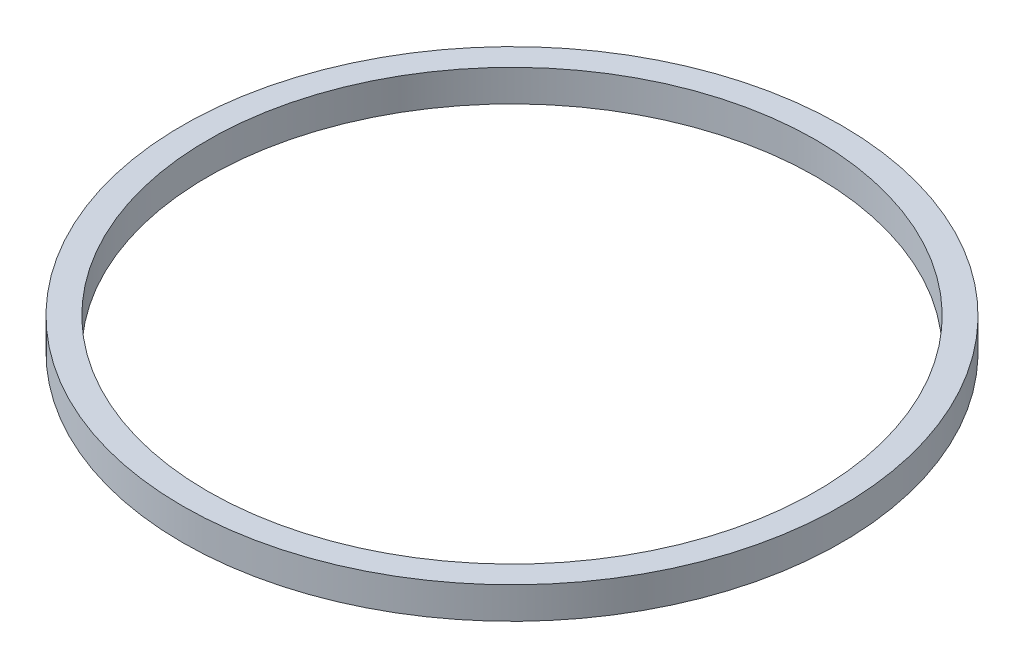
ISO-10303-21;
HEADER;
FILE_DESCRIPTION(('STEP AP214'),'2;1');
FILE_NAME('part.step','',(''),(''),'','','');
FILE_SCHEMA(('AUTOMOTIVE_DESIGN { 1 0 10303 214 1 1 1 1 }'));
ENDSEC;
DATA;
#1=APPLICATION_CONTEXT('core data for automotive mechanical design processes');
#2=APPLICATION_PROTOCOL_DEFINITION('international standard','automotive_design',2000,#1);
#3=PRODUCT_CONTEXT('',#1,'mechanical');
#4=PRODUCT('Part','Part','',(#3));
#5=PRODUCT_RELATED_PRODUCT_CATEGORY('part','',(#4));
#6=PRODUCT_DEFINITION_FORMATION('','',#4);
#7=PRODUCT_DEFINITION_CONTEXT('part definition',#1,'design');
#8=PRODUCT_DEFINITION('design','',#6,#7);
#9=PRODUCT_DEFINITION_SHAPE('','',#8);
#10=(LENGTH_UNIT() NAMED_UNIT(*) SI_UNIT(.MILLI.,.METRE.));
#11=(NAMED_UNIT(*) PLANE_ANGLE_UNIT() SI_UNIT($,.RADIAN.));
#12=(NAMED_UNIT(*) SI_UNIT($,.STERADIAN.) SOLID_ANGLE_UNIT());
#13=UNCERTAINTY_MEASURE_WITH_UNIT(LENGTH_MEASURE(1.E-05),#10,'distance_accuracy_value','');
#14=(GEOMETRIC_REPRESENTATION_CONTEXT(3) GLOBAL_UNCERTAINTY_ASSIGNED_CONTEXT((#13)) GLOBAL_UNIT_ASSIGNED_CONTEXT((#10,
#11,#12)) REPRESENTATION_CONTEXT('',''));
#15=CARTESIAN_POINT('',(0.,0.,0.));
#16=DIRECTION('',(0.,0.,1.));
#17=DIRECTION('',(1.,0.,0.));
#18=AXIS2_PLACEMENT_3D('',#15,#16,#17);
#19=CARTESIAN_POINT('',(0.,2.5,0.));
#20=DIRECTION('',(0.,1.,0.));
#21=DIRECTION('',(0.,0.,1.));
#22=AXIS2_PLACEMENT_3D('',#19,#20,#21);
#23=PLANE('',#22);
#24=CARTESIAN_POINT('',(0.,2.5,0.));
#25=DIRECTION('',(0.,1.,0.));
#26=DIRECTION('',(0.,0.,1.));
#27=AXIS2_PLACEMENT_3D('',#24,#25,#26);
#28=CIRCLE('',#27,26.);
#29=CARTESIAN_POINT('',(0.,2.5,26.));
#30=VERTEX_POINT('',#29);
#31=EDGE_CURVE('E10',#30,#30,#28,.T.);
#32=ORIENTED_EDGE('',*,*,#31,.T.);
#33=EDGE_LOOP('',(#32));
#34=FACE_BOUND('',#33,.T.);
#35=CARTESIAN_POINT('',(0.,2.5,0.));
#36=DIRECTION('',(0.,1.,0.));
#37=DIRECTION('',(0.,0.,1.));
#38=AXIS2_PLACEMENT_3D('',#35,#36,#37);
#39=CIRCLE('',#38,24.);
#40=CARTESIAN_POINT('',(0.,2.5,24.));
#41=VERTEX_POINT('',#40);
#42=EDGE_CURVE('E56',#41,#41,#39,.T.);
#43=ORIENTED_EDGE('',*,*,#42,.F.);
#44=EDGE_LOOP('',(#43));
#45=FACE_BOUND('',#44,.T.);
#46=ADVANCED_FACE('F43',(#34,#45),#23,.T.);
#47=CARTESIAN_POINT('',(0.,0.,0.));
#48=DIRECTION('',(0.,1.,0.));
#49=DIRECTION('',(0.,0.,1.));
#50=AXIS2_PLACEMENT_3D('',#47,#48,#49);
#51=PLANE('',#50);
#52=CARTESIAN_POINT('',(0.,0.,0.));
#53=DIRECTION('',(0.,1.,0.));
#54=DIRECTION('',(0.,0.,1.));
#55=AXIS2_PLACEMENT_3D('',#52,#53,#54);
#56=CIRCLE('',#55,26.);
#57=CARTESIAN_POINT('',(0.,0.,26.));
#58=VERTEX_POINT('',#57);
#59=EDGE_CURVE('E47',#58,#58,#56,.T.);
#60=ORIENTED_EDGE('',*,*,#59,.F.);
#61=EDGE_LOOP('',(#60));
#62=FACE_BOUND('',#61,.T.);
#63=CARTESIAN_POINT('',(0.,0.,0.));
#64=DIRECTION('',(0.,1.,0.));
#65=DIRECTION('',(0.,0.,1.));
#66=AXIS2_PLACEMENT_3D('',#63,#64,#65);
#67=CIRCLE('',#66,24.);
#68=CARTESIAN_POINT('',(0.,0.,24.));
#69=VERTEX_POINT('',#68);
#70=EDGE_CURVE('E58',#69,#69,#67,.T.);
#71=ORIENTED_EDGE('',*,*,#70,.T.);
#72=EDGE_LOOP('',(#71));
#73=FACE_BOUND('',#72,.T.);
#74=ADVANCED_FACE('F70',(#62,#73),#51,.F.);
#75=CARTESIAN_POINT('',(0.,2.5,0.));
#76=DIRECTION('',(0.,-1.,0.));
#77=DIRECTION('',(0.,0.,-1.));
#78=AXIS2_PLACEMENT_3D('',#75,#76,#77);
#79=CYLINDRICAL_SURFACE('',#78,26.);
#80=ORIENTED_EDGE('',*,*,#31,.F.);
#81=EDGE_LOOP('',(#80));
#82=FACE_BOUND('',#81,.T.);
#83=ORIENTED_EDGE('',*,*,#59,.T.);
#84=EDGE_LOOP('',(#83));
#85=FACE_BOUND('',#84,.T.);
#86=ADVANCED_FACE('F45',(#82,#85),#79,.T.);
#87=CARTESIAN_POINT('',(0.,2.5,0.));
#88=DIRECTION('',(0.,-1.,0.));
#89=DIRECTION('',(0.,0.,-1.));
#90=AXIS2_PLACEMENT_3D('',#87,#88,#89);
#91=CYLINDRICAL_SURFACE('',#90,24.);
#92=ORIENTED_EDGE('',*,*,#42,.T.);
#93=EDGE_LOOP('',(#92));
#94=FACE_BOUND('',#93,.T.);
#95=ORIENTED_EDGE('',*,*,#70,.F.);
#96=EDGE_LOOP('',(#95));
#97=FACE_BOUND('',#96,.T.);
#98=ADVANCED_FACE('F66',(#94,#97),#91,.F.);
#99=CLOSED_SHELL('',(#46,#74,#86,#98));
#100=MANIFOLD_SOLID_BREP('B2',#99);
#101=ADVANCED_BREP_SHAPE_REPRESENTATION('',(#18,#100),#14);
#102=SHAPE_DEFINITION_REPRESENTATION(#9,#101);
ENDSEC;
END-ISO-10303-21;
